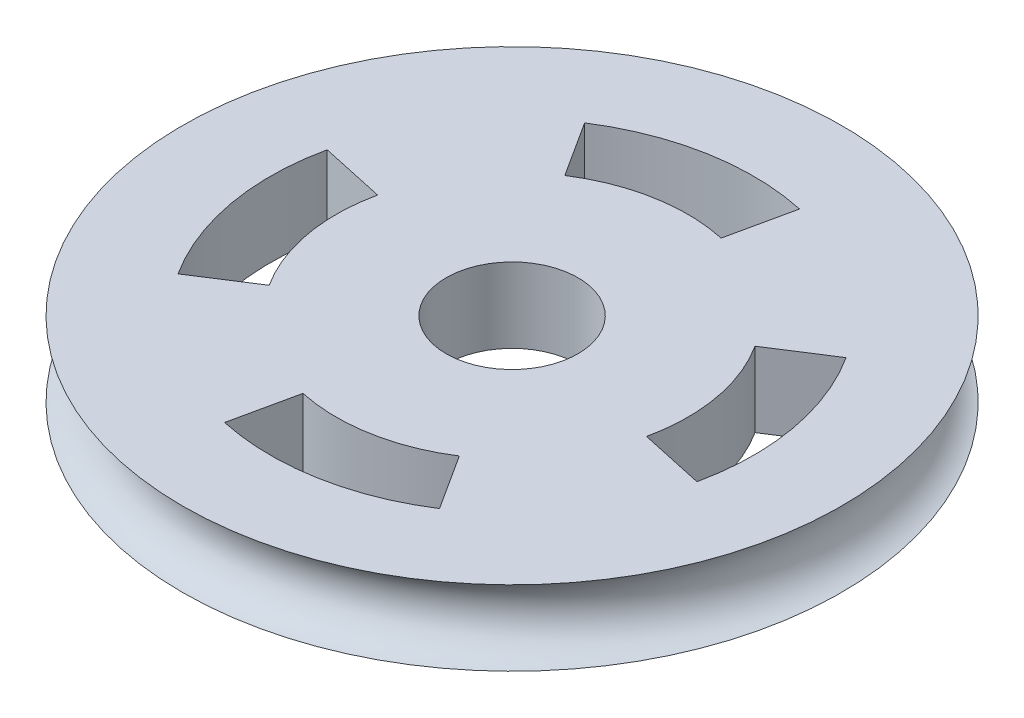
ISO-10303-21;
HEADER;
FILE_DESCRIPTION(('STEP AP214'),'2;1');
FILE_NAME('part.step','',(''),(''),'','','');
FILE_SCHEMA(('AUTOMOTIVE_DESIGN { 1 0 10303 214 1 1 1 1 }'));
ENDSEC;
DATA;
#1=APPLICATION_CONTEXT('core data for automotive mechanical design processes');
#2=APPLICATION_PROTOCOL_DEFINITION('international standard','automotive_design',2000,#1);
#3=PRODUCT_CONTEXT('',#1,'mechanical');
#4=PRODUCT('Part','Part','',(#3));
#5=PRODUCT_RELATED_PRODUCT_CATEGORY('part','',(#4));
#6=PRODUCT_DEFINITION_FORMATION('','',#4);
#7=PRODUCT_DEFINITION_CONTEXT('part definition',#1,'design');
#8=PRODUCT_DEFINITION('design','',#6,#7);
#9=PRODUCT_DEFINITION_SHAPE('','',#8);
#10=(LENGTH_UNIT() NAMED_UNIT(*) SI_UNIT(.MILLI.,.METRE.));
#11=(NAMED_UNIT(*) PLANE_ANGLE_UNIT() SI_UNIT($,.RADIAN.));
#12=(NAMED_UNIT(*) SI_UNIT($,.STERADIAN.) SOLID_ANGLE_UNIT());
#13=UNCERTAINTY_MEASURE_WITH_UNIT(LENGTH_MEASURE(1.E-05),#10,'distance_accuracy_value','');
#14=(GEOMETRIC_REPRESENTATION_CONTEXT(3) GLOBAL_UNCERTAINTY_ASSIGNED_CONTEXT((#13)) GLOBAL_UNIT_ASSIGNED_CONTEXT((#10,
#11,#12)) REPRESENTATION_CONTEXT('',''));
#15=CARTESIAN_POINT('',(0.,0.,0.));
#16=DIRECTION('',(0.,0.,1.));
#17=DIRECTION('',(1.,0.,0.));
#18=AXIS2_PLACEMENT_3D('',#15,#16,#17);
#19=CARTESIAN_POINT('',(0.2,-0.851836251870041,0.));
#20=DIRECTION('',(0.,-1.,0.));
#21=DIRECTION('',(0.,0.,-1.));
#22=AXIS2_PLACEMENT_3D('',#19,#20,#21);
#23=PLANE('',#22);
#24=CARTESIAN_POINT('',(7.7,-0.851836251870041,0.));
#25=DIRECTION('',(0.,1.,0.));
#26=DIRECTION('',(0.,0.,1.));
#27=AXIS2_PLACEMENT_3D('',#24,#25,#26);
#28=CIRCLE('',#27,1.5);
#29=CARTESIAN_POINT('',(7.7,-0.851836251870041,1.5));
#30=VERTEX_POINT('',#29);
#31=EDGE_CURVE('E45',#30,#30,#28,.T.);
#32=ORIENTED_EDGE('',*,*,#31,.T.);
#33=EDGE_LOOP('',(#32));
#34=FACE_BOUND('',#33,.T.);
#35=CARTESIAN_POINT('',(7.7,-0.851836251870041,0.));
#36=DIRECTION('',(0.,1.,0.));
#37=DIRECTION('',(0.,0.,1.));
#38=AXIS2_PLACEMENT_3D('',#35,#36,#37);
#39=CIRCLE('',#38,7.5);
#40=CARTESIAN_POINT('',(7.7,-0.851836251870041,7.5));
#41=VERTEX_POINT('',#40);
#42=EDGE_CURVE('E11',#41,#41,#39,.T.);
#43=ORIENTED_EDGE('',*,*,#42,.F.);
#44=EDGE_LOOP('',(#43));
#45=FACE_BOUND('',#44,.T.);
#46=DIRECTION('',(0.841060390721997,0.,-0.54094123447798));
#47=VECTOR('',#46,1.);
#48=CARTESIAN_POINT('',(2.25315412752092,-0.851836251870041,3.50322469441321));
#49=LINE('',#48,#47);
#50=CARTESIAN_POINT('',(3.07416785102901,-0.851836251870041,2.97517678962889));
#51=VERTEX_POINT('',#50);
#52=CARTESIAN_POINT('',(4.33575843711201,-0.851836251870041,2.16376493791192));
#53=VERTEX_POINT('',#52);
#54=EDGE_CURVE('E262',#51,#53,#49,.T.);
#55=ORIENTED_EDGE('',*,*,#54,.T.);
#56=CARTESIAN_POINT('',(7.7,-0.851836251870041,0.));
#57=DIRECTION('',(0.,-1.,0.));
#58=DIRECTION('',(0.,0.,-1.));
#59=AXIS2_PLACEMENT_3D('',#56,#57,#58);
#60=CIRCLE('',#59,4.);
#61=CARTESIAN_POINT('',(3.79110911684106,-0.851836251870041,-0.848865162176499));
#62=VERTEX_POINT('',#61);
#63=EDGE_CURVE('E188',#53,#62,#60,.T.);
#64=ORIENTED_EDGE('',*,*,#63,.T.);
#65=DIRECTION('',(-0.977222720789735,0.,-0.212216290544125));
#66=VECTOR('',#65,1.);
#67=CARTESIAN_POINT('',(0.346775305586774,-0.851836251870041,-1.59684587247904));
#68=LINE('',#67,#66);
#69=CARTESIAN_POINT('',(2.32527503565646,-0.851836251870041,-1.16718959799269));
#70=VERTEX_POINT('',#69);
#71=EDGE_CURVE('E252',#62,#70,#68,.T.);
#72=ORIENTED_EDGE('',*,*,#71,.T.);
#73=CARTESIAN_POINT('',(7.7,-0.851836251870041,0.));
#74=DIRECTION('',(0.,-1.,0.));
#75=DIRECTION('',(0.,0.,-1.));
#76=AXIS2_PLACEMENT_3D('',#73,#74,#75);
#77=CIRCLE('',#76,5.5);
#78=EDGE_CURVE('E265',#51,#70,#77,.T.);
#79=ORIENTED_EDGE('',*,*,#78,.F.);
#80=EDGE_LOOP('',(#55,#64,#72,#79));
#81=FACE_BOUND('',#80,.T.);
#82=DIRECTION('',(0.540941234477989,0.,0.841060390721992));
#83=VECTOR('',#82,1.);
#84=CARTESIAN_POINT('',(4.19677530558673,-0.851836251870041,-5.44684587247904));
#85=LINE('',#84,#83);
#86=CARTESIAN_POINT('',(4.72482321037106,-0.851836251870041,-4.62583214897096));
#87=VERTEX_POINT('',#86);
#88=CARTESIAN_POINT('',(5.53623506208805,-0.851836251870041,-3.36424156288797));
#89=VERTEX_POINT('',#88);
#90=EDGE_CURVE('E233',#87,#89,#85,.T.);
#91=ORIENTED_EDGE('',*,*,#90,.T.);
#92=CARTESIAN_POINT('',(7.7,-0.851836251870041,0.));
#93=DIRECTION('',(0.,-1.,0.));
#94=DIRECTION('',(1.,0.,0.));
#95=AXIS2_PLACEMENT_3D('',#92,#93,#94);
#96=CIRCLE('',#95,4.);
#97=CARTESIAN_POINT('',(8.54886516217646,-0.851836251870041,-3.90889088315895));
#98=VERTEX_POINT('',#97);
#99=EDGE_CURVE('E230',#89,#98,#96,.T.);
#100=ORIENTED_EDGE('',*,*,#99,.T.);
#101=DIRECTION('',(0.212216290544114,0.,-0.977222720789737));
#102=VECTOR('',#101,1.);
#103=CARTESIAN_POINT('',(9.29684587247897,-0.851836251870041,-7.35322469441324));
#104=LINE('',#103,#102);
#105=CARTESIAN_POINT('',(8.86718959799263,-0.851836251870041,-5.37472496434355));
#106=VERTEX_POINT('',#105);
#107=EDGE_CURVE('E222',#98,#106,#104,.T.);
#108=ORIENTED_EDGE('',*,*,#107,.T.);
#109=CARTESIAN_POINT('',(7.7,-0.851836251870041,0.));
#110=DIRECTION('',(0.,-1.,0.));
#111=DIRECTION('',(1.,0.,0.));
#112=AXIS2_PLACEMENT_3D('',#109,#110,#111);
#113=CIRCLE('',#112,5.5);
#114=EDGE_CURVE('E236',#87,#106,#113,.T.);
#115=ORIENTED_EDGE('',*,*,#114,.F.);
#116=EDGE_LOOP('',(#91,#100,#108,#115));
#117=FACE_BOUND('',#116,.T.);
#118=DIRECTION('',(-0.841060390721997,0.,0.54094123447798));
#119=VECTOR('',#118,1.);
#120=CARTESIAN_POINT('',(13.1468458724791,-0.851836251870041,-3.50322469441321));
#121=LINE('',#120,#119);
#122=CARTESIAN_POINT('',(12.325832148971,-0.851836251870041,-2.97517678962889));
#123=VERTEX_POINT('',#122);
#124=CARTESIAN_POINT('',(11.064241562888,-0.851836251870041,-2.16376493791192));
#125=VERTEX_POINT('',#124);
#126=EDGE_CURVE('E204',#123,#125,#121,.T.);
#127=ORIENTED_EDGE('',*,*,#126,.T.);
#128=CARTESIAN_POINT('',(7.7,-0.851836251870041,0.));
#129=DIRECTION('',(0.,-1.,0.));
#130=DIRECTION('',(0.,0.,1.));
#131=AXIS2_PLACEMENT_3D('',#128,#129,#130);
#132=CIRCLE('',#131,4.);
#133=CARTESIAN_POINT('',(11.6088908831589,-0.851836251870041,0.848865162176499));
#134=VERTEX_POINT('',#133);
#135=EDGE_CURVE('E60',#125,#134,#132,.T.);
#136=ORIENTED_EDGE('',*,*,#135,.T.);
#137=DIRECTION('',(0.977222720789735,0.,0.212216290544125));
#138=VECTOR('',#137,1.);
#139=CARTESIAN_POINT('',(15.0532246944132,-0.851836251870041,1.59684587247904));
#140=LINE('',#139,#138);
#141=CARTESIAN_POINT('',(13.0747249643435,-0.851836251870041,1.16718959799269));
#142=VERTEX_POINT('',#141);
#143=EDGE_CURVE('E195',#134,#142,#140,.T.);
#144=ORIENTED_EDGE('',*,*,#143,.T.);
#145=CARTESIAN_POINT('',(7.7,-0.851836251870041,0.));
#146=DIRECTION('',(0.,-1.,0.));
#147=DIRECTION('',(0.,0.,1.));
#148=AXIS2_PLACEMENT_3D('',#145,#146,#147);
#149=CIRCLE('',#148,5.5);
#150=EDGE_CURVE('E208',#123,#142,#149,.T.);
#151=ORIENTED_EDGE('',*,*,#150,.F.);
#152=EDGE_LOOP('',(#127,#136,#144,#151));
#153=FACE_BOUND('',#152,.T.);
#154=DIRECTION('',(-0.540941234477983,0.,-0.841060390721996));
#155=VECTOR('',#154,1.);
#156=CARTESIAN_POINT('',(11.2032246944132,-0.851836251870041,5.44684587247907));
#157=LINE('',#156,#155);
#158=CARTESIAN_POINT('',(10.6751767896289,-0.851836251870041,4.62583214897098));
#159=VERTEX_POINT('',#158);
#160=CARTESIAN_POINT('',(9.86376493791193,-0.851836251870041,3.36424156288798));
#161=VERTEX_POINT('',#160);
#162=EDGE_CURVE('E181',#159,#161,#157,.T.);
#163=ORIENTED_EDGE('',*,*,#162,.T.);
#164=CARTESIAN_POINT('',(7.7,-0.851836251870041,0.));
#165=DIRECTION('',(0.,-1.,0.));
#166=DIRECTION('',(-1.,0.,0.));
#167=AXIS2_PLACEMENT_3D('',#164,#165,#166);
#168=CIRCLE('',#167,4.);
#169=CARTESIAN_POINT('',(6.85113483782352,-0.851836251870041,3.90889088315894));
#170=VERTEX_POINT('',#169);
#171=EDGE_CURVE('E52',#161,#170,#168,.T.);
#172=ORIENTED_EDGE('',*,*,#171,.T.);
#173=DIRECTION('',(-0.212216290544121,0.,0.977222720789736));
#174=VECTOR('',#173,1.);
#175=CARTESIAN_POINT('',(6.10315412752098,-0.851836251870041,7.35322469441323));
#176=LINE('',#175,#174);
#177=CARTESIAN_POINT('',(6.53281040200733,-0.851836251870041,5.37472496434354));
#178=VERTEX_POINT('',#177);
#179=EDGE_CURVE('E172',#170,#178,#176,.T.);
#180=ORIENTED_EDGE('',*,*,#179,.T.);
#181=CARTESIAN_POINT('',(7.7,-0.851836251870041,0.));
#182=DIRECTION('',(0.,-1.,0.));
#183=DIRECTION('',(-1.,0.,0.));
#184=AXIS2_PLACEMENT_3D('',#181,#182,#183);
#185=CIRCLE('',#184,5.5);
#186=EDGE_CURVE('E175',#159,#178,#185,.T.);
#187=ORIENTED_EDGE('',*,*,#186,.F.);
#188=EDGE_LOOP('',(#163,#172,#180,#187));
#189=FACE_BOUND('',#188,.T.);
#190=ADVANCED_FACE('F37',(#34,#45,#81,#117,#153,#189),#23,.T.);
#191=CARTESIAN_POINT('',(0.2,0.851836251870041,0.));
#192=DIRECTION('',(0.,1.,0.));
#193=DIRECTION('',(0.,0.,1.));
#194=AXIS2_PLACEMENT_3D('',#191,#192,#193);
#195=PLANE('',#194);
#196=CARTESIAN_POINT('',(7.7,0.851836251870041,0.));
#197=DIRECTION('',(0.,1.,0.));
#198=DIRECTION('',(0.,0.,1.));
#199=AXIS2_PLACEMENT_3D('',#196,#197,#198);
#200=CIRCLE('',#199,7.5);
#201=CARTESIAN_POINT('',(7.7,0.851836251870041,7.5));
#202=VERTEX_POINT('',#201);
#203=EDGE_CURVE('E273',#202,#202,#200,.T.);
#204=ORIENTED_EDGE('',*,*,#203,.T.);
#205=EDGE_LOOP('',(#204));
#206=FACE_BOUND('',#205,.T.);
#207=CARTESIAN_POINT('',(7.7,0.851836251870041,0.));
#208=DIRECTION('',(0.,1.,0.));
#209=DIRECTION('',(0.,0.,1.));
#210=AXIS2_PLACEMENT_3D('',#207,#208,#209);
#211=CIRCLE('',#210,1.5);
#212=CARTESIAN_POINT('',(7.7,0.851836251870041,1.5));
#213=VERTEX_POINT('',#212);
#214=EDGE_CURVE('E282',#213,#213,#211,.T.);
#215=ORIENTED_EDGE('',*,*,#214,.F.);
#216=EDGE_LOOP('',(#215));
#217=FACE_BOUND('',#216,.T.);
#218=DIRECTION('',(-0.977222720789735,0.,-0.212216290544125));
#219=VECTOR('',#218,1.);
#220=CARTESIAN_POINT('',(0.346775305586774,0.851836251870041,-1.59684587247904));
#221=LINE('',#220,#219);
#222=CARTESIAN_POINT('',(3.79110911684106,0.851836251870041,-0.848865162176499));
#223=VERTEX_POINT('',#222);
#224=CARTESIAN_POINT('',(2.32527503565646,0.851836251870041,-1.16718959799269));
#225=VERTEX_POINT('',#224);
#226=EDGE_CURVE('E257',#223,#225,#221,.T.);
#227=ORIENTED_EDGE('',*,*,#226,.F.);
#228=CARTESIAN_POINT('',(7.7,0.851836251870041,0.));
#229=DIRECTION('',(0.,-1.,0.));
#230=DIRECTION('',(0.,0.,-1.));
#231=AXIS2_PLACEMENT_3D('',#228,#229,#230);
#232=CIRCLE('',#231,4.);
#233=CARTESIAN_POINT('',(4.33575843711201,0.851836251870041,2.16376493791192));
#234=VERTEX_POINT('',#233);
#235=EDGE_CURVE('E249',#234,#223,#232,.T.);
#236=ORIENTED_EDGE('',*,*,#235,.F.);
#237=DIRECTION('',(0.841060390721997,0.,-0.54094123447798));
#238=VECTOR('',#237,1.);
#239=CARTESIAN_POINT('',(2.25315412752092,0.851836251870041,3.50322469441321));
#240=LINE('',#239,#238);
#241=CARTESIAN_POINT('',(3.07416785102901,0.851836251870041,2.97517678962889));
#242=VERTEX_POINT('',#241);
#243=EDGE_CURVE('E251',#242,#234,#240,.T.);
#244=ORIENTED_EDGE('',*,*,#243,.F.);
#245=CARTESIAN_POINT('',(7.7,0.851836251870041,0.));
#246=DIRECTION('',(0.,-1.,0.));
#247=DIRECTION('',(0.,0.,-1.));
#248=AXIS2_PLACEMENT_3D('',#245,#246,#247);
#249=CIRCLE('',#248,5.5);
#250=EDGE_CURVE('E254',#242,#225,#249,.T.);
#251=ORIENTED_EDGE('',*,*,#250,.T.);
#252=EDGE_LOOP('',(#227,#236,#244,#251));
#253=FACE_BOUND('',#252,.T.);
#254=DIRECTION('',(0.212216290544114,0.,-0.977222720789737));
#255=VECTOR('',#254,1.);
#256=CARTESIAN_POINT('',(9.29684587247897,0.851836251870041,-7.35322469441324));
#257=LINE('',#256,#255);
#258=CARTESIAN_POINT('',(8.54886516217646,0.851836251870041,-3.90889088315895));
#259=VERTEX_POINT('',#258);
#260=CARTESIAN_POINT('',(8.86718959799263,0.851836251870041,-5.37472496434355));
#261=VERTEX_POINT('',#260);
#262=EDGE_CURVE('E227',#259,#261,#257,.T.);
#263=ORIENTED_EDGE('',*,*,#262,.F.);
#264=CARTESIAN_POINT('',(7.7,0.851836251870041,0.));
#265=DIRECTION('',(0.,-1.,0.));
#266=DIRECTION('',(1.,0.,0.));
#267=AXIS2_PLACEMENT_3D('',#264,#265,#266);
#268=CIRCLE('',#267,4.);
#269=CARTESIAN_POINT('',(5.53623506208805,0.851836251870041,-3.36424156288797));
#270=VERTEX_POINT('',#269);
#271=EDGE_CURVE('E219',#270,#259,#268,.T.);
#272=ORIENTED_EDGE('',*,*,#271,.F.);
#273=DIRECTION('',(0.540941234477989,0.,0.841060390721992));
#274=VECTOR('',#273,1.);
#275=CARTESIAN_POINT('',(4.19677530558673,0.851836251870041,-5.44684587247904));
#276=LINE('',#275,#274);
#277=CARTESIAN_POINT('',(4.72482321037106,0.851836251870041,-4.62583214897096));
#278=VERTEX_POINT('',#277);
#279=EDGE_CURVE('E221',#278,#270,#276,.T.);
#280=ORIENTED_EDGE('',*,*,#279,.F.);
#281=CARTESIAN_POINT('',(7.7,0.851836251870041,0.));
#282=DIRECTION('',(0.,-1.,0.));
#283=DIRECTION('',(1.,0.,0.));
#284=AXIS2_PLACEMENT_3D('',#281,#282,#283);
#285=CIRCLE('',#284,5.5);
#286=EDGE_CURVE('E224',#278,#261,#285,.T.);
#287=ORIENTED_EDGE('',*,*,#286,.T.);
#288=EDGE_LOOP('',(#263,#272,#280,#287));
#289=FACE_BOUND('',#288,.T.);
#290=DIRECTION('',(0.977222720789735,0.,0.212216290544125));
#291=VECTOR('',#290,1.);
#292=CARTESIAN_POINT('',(15.0532246944132,0.851836251870041,1.59684587247904));
#293=LINE('',#292,#291);
#294=CARTESIAN_POINT('',(11.6088908831589,0.851836251870041,0.848865162176499));
#295=VERTEX_POINT('',#294);
#296=CARTESIAN_POINT('',(13.0747249643435,0.851836251870041,1.16718959799269));
#297=VERTEX_POINT('',#296);
#298=EDGE_CURVE('E200',#295,#297,#293,.T.);
#299=ORIENTED_EDGE('',*,*,#298,.F.);
#300=CARTESIAN_POINT('',(7.7,0.851836251870041,0.));
#301=DIRECTION('',(0.,-1.,0.));
#302=DIRECTION('',(0.,0.,1.));
#303=AXIS2_PLACEMENT_3D('',#300,#301,#302);
#304=CIRCLE('',#303,4.);
#305=CARTESIAN_POINT('',(11.064241562888,0.851836251870041,-2.16376493791192));
#306=VERTEX_POINT('',#305);
#307=EDGE_CURVE('E192',#306,#295,#304,.T.);
#308=ORIENTED_EDGE('',*,*,#307,.F.);
#309=DIRECTION('',(-0.841060390721997,0.,0.54094123447798));
#310=VECTOR('',#309,1.);
#311=CARTESIAN_POINT('',(13.1468458724791,0.851836251870041,-3.50322469441321));
#312=LINE('',#311,#310);
#313=CARTESIAN_POINT('',(12.325832148971,0.851836251870041,-2.97517678962889));
#314=VERTEX_POINT('',#313);
#315=EDGE_CURVE('E194',#314,#306,#312,.T.);
#316=ORIENTED_EDGE('',*,*,#315,.F.);
#317=CARTESIAN_POINT('',(7.7,0.851836251870041,0.));
#318=DIRECTION('',(0.,-1.,0.));
#319=DIRECTION('',(0.,0.,1.));
#320=AXIS2_PLACEMENT_3D('',#317,#318,#319);
#321=CIRCLE('',#320,5.5);
#322=EDGE_CURVE('E197',#314,#297,#321,.T.);
#323=ORIENTED_EDGE('',*,*,#322,.T.);
#324=EDGE_LOOP('',(#299,#308,#316,#323));
#325=FACE_BOUND('',#324,.T.);
#326=DIRECTION('',(-0.212216290544121,0.,0.977222720789736));
#327=VECTOR('',#326,1.);
#328=CARTESIAN_POINT('',(6.10315412752098,0.851836251870041,7.35322469441323));
#329=LINE('',#328,#327);
#330=CARTESIAN_POINT('',(6.85113483782352,0.851836251870041,3.90889088315894));
#331=VERTEX_POINT('',#330);
#332=CARTESIAN_POINT('',(6.53281040200733,0.851836251870041,5.37472496434354));
#333=VERTEX_POINT('',#332);
#334=EDGE_CURVE('E168',#331,#333,#329,.T.);
#335=ORIENTED_EDGE('',*,*,#334,.F.);
#336=CARTESIAN_POINT('',(7.7,0.851836251870041,0.));
#337=DIRECTION('',(0.,-1.,0.));
#338=DIRECTION('',(-1.,0.,0.));
#339=AXIS2_PLACEMENT_3D('',#336,#337,#338);
#340=CIRCLE('',#339,4.);
#341=CARTESIAN_POINT('',(9.86376493791193,0.851836251870041,3.36424156288798));
#342=VERTEX_POINT('',#341);
#343=EDGE_CURVE('E164',#342,#331,#340,.T.);
#344=ORIENTED_EDGE('',*,*,#343,.F.);
#345=DIRECTION('',(-0.540941234477983,0.,-0.841060390721996));
#346=VECTOR('',#345,1.);
#347=CARTESIAN_POINT('',(11.2032246944132,0.851836251870041,5.44684587247907));
#348=LINE('',#347,#346);
#349=CARTESIAN_POINT('',(10.6751767896289,0.851836251870041,4.62583214897098));
#350=VERTEX_POINT('',#349);
#351=EDGE_CURVE('E154',#350,#342,#348,.T.);
#352=ORIENTED_EDGE('',*,*,#351,.F.);
#353=CARTESIAN_POINT('',(7.7,0.851836251870041,0.));
#354=DIRECTION('',(0.,-1.,0.));
#355=DIRECTION('',(-1.,0.,0.));
#356=AXIS2_PLACEMENT_3D('',#353,#354,#355);
#357=CIRCLE('',#356,5.5);
#358=EDGE_CURVE('E163',#350,#333,#357,.T.);
#359=ORIENTED_EDGE('',*,*,#358,.T.);
#360=EDGE_LOOP('',(#335,#344,#352,#359));
#361=FACE_BOUND('',#360,.T.);
#362=ADVANCED_FACE('F171',(#206,#217,#253,#289,#325,#361),#195,.T.);
#363=CARTESIAN_POINT('',(7.7,0.,0.));
#364=DIRECTION('',(0.,1.,0.));
#365=DIRECTION('',(0.,0.,1.));
#366=AXIS2_PLACEMENT_3D('',#363,#364,#365);
#367=TOROIDAL_SURFACE('',#366,7.7,0.875);
#368=ORIENTED_EDGE('',*,*,#42,.T.);
#369=EDGE_LOOP('',(#368));
#370=FACE_BOUND('',#369,.T.);
#371=ORIENTED_EDGE('',*,*,#203,.F.);
#372=EDGE_LOOP('',(#371));
#373=FACE_BOUND('',#372,.T.);
#374=ADVANCED_FACE('F39',(#370,#373),#367,.F.);
#375=CARTESIAN_POINT('',(7.7,1.61903573430155,0.));
#376=DIRECTION('',(0.,1.,0.));
#377=DIRECTION('',(0.,0.,1.));
#378=AXIS2_PLACEMENT_3D('',#375,#376,#377);
#379=CYLINDRICAL_SURFACE('',#378,1.5);
#380=ORIENTED_EDGE('',*,*,#214,.T.);
#381=EDGE_LOOP('',(#380));
#382=FACE_BOUND('',#381,.T.);
#383=ORIENTED_EDGE('',*,*,#31,.F.);
#384=EDGE_LOOP('',(#383));
#385=FACE_BOUND('',#384,.T.);
#386=ADVANCED_FACE('F289',(#382,#385),#379,.F.);
#387=CARTESIAN_POINT('',(7.7,0.851836251870041,0.));
#388=DIRECTION('',(0.,-1.,0.));
#389=DIRECTION('',(0.,0.,-1.));
#390=AXIS2_PLACEMENT_3D('',#387,#388,#389);
#391=CYLINDRICAL_SURFACE('',#390,4.);
#392=ORIENTED_EDGE('',*,*,#63,.F.);
#393=DIRECTION('',(0.,-1.,0.));
#394=VECTOR('',#393,1.);
#395=CARTESIAN_POINT('',(4.33575843711201,0.851836251870041,2.16376493791192));
#396=LINE('',#395,#394);
#397=EDGE_CURVE('E259',#234,#53,#396,.T.);
#398=ORIENTED_EDGE('',*,*,#397,.F.);
#399=ORIENTED_EDGE('',*,*,#235,.T.);
#400=DIRECTION('',(0.,-1.,0.));
#401=VECTOR('',#400,1.);
#402=CARTESIAN_POINT('',(3.79110911684106,0.851836251870041,-0.848865162176499));
#403=LINE('',#402,#401);
#404=EDGE_CURVE('E270',#223,#62,#403,.T.);
#405=ORIENTED_EDGE('',*,*,#404,.T.);
#406=EDGE_LOOP('',(#392,#398,#399,#405));
#407=FACE_BOUND('',#406,.T.);
#408=ADVANCED_FACE('F291',(#407),#391,.T.);
#409=CARTESIAN_POINT('',(0.346775305586774,0.851836251870041,-1.59684587247904));
#410=DIRECTION('',(-0.212216290544125,0.,0.977222720789735));
#411=DIRECTION('',(0.977222720789735,0.,0.212216290544125));
#412=AXIS2_PLACEMENT_3D('',#409,#410,#411);
#413=PLANE('',#412);
#414=ORIENTED_EDGE('',*,*,#71,.F.);
#415=ORIENTED_EDGE('',*,*,#404,.F.);
#416=ORIENTED_EDGE('',*,*,#226,.T.);
#417=DIRECTION('',(0.,-1.,0.));
#418=VECTOR('',#417,1.);
#419=CARTESIAN_POINT('',(2.32527503565646,0.851836251870041,-1.16718959799269));
#420=LINE('',#419,#418);
#421=EDGE_CURVE('E274',#225,#70,#420,.T.);
#422=ORIENTED_EDGE('',*,*,#421,.T.);
#423=EDGE_LOOP('',(#414,#415,#416,#422));
#424=FACE_BOUND('',#423,.T.);
#425=ADVANCED_FACE('F298',(#424),#413,.T.);
#426=CARTESIAN_POINT('',(7.7,0.851836251870041,0.));
#427=DIRECTION('',(0.,-1.,0.));
#428=DIRECTION('',(0.,0.,-1.));
#429=AXIS2_PLACEMENT_3D('',#426,#427,#428);
#430=CYLINDRICAL_SURFACE('',#429,5.5);
#431=ORIENTED_EDGE('',*,*,#78,.T.);
#432=ORIENTED_EDGE('',*,*,#421,.F.);
#433=ORIENTED_EDGE('',*,*,#250,.F.);
#434=DIRECTION('',(0.,-1.,0.));
#435=VECTOR('',#434,1.);
#436=CARTESIAN_POINT('',(3.07416785102901,0.851836251870041,2.97517678962889));
#437=LINE('',#436,#435);
#438=EDGE_CURVE('E276',#242,#51,#437,.T.);
#439=ORIENTED_EDGE('',*,*,#438,.T.);
#440=EDGE_LOOP('',(#431,#432,#433,#439));
#441=FACE_BOUND('',#440,.T.);
#442=ADVANCED_FACE('F316',(#441),#430,.F.);
#443=CARTESIAN_POINT('',(2.25315412752092,0.851836251870041,3.50322469441321));
#444=DIRECTION('',(-0.54094123447798,0.,-0.841060390721997));
#445=DIRECTION('',(-0.841060390721997,0.,0.54094123447798));
#446=AXIS2_PLACEMENT_3D('',#443,#444,#445);
#447=PLANE('',#446);
#448=ORIENTED_EDGE('',*,*,#54,.F.);
#449=ORIENTED_EDGE('',*,*,#438,.F.);
#450=ORIENTED_EDGE('',*,*,#243,.T.);
#451=ORIENTED_EDGE('',*,*,#397,.T.);
#452=EDGE_LOOP('',(#448,#449,#450,#451));
#453=FACE_BOUND('',#452,.T.);
#454=ADVANCED_FACE('F312',(#453),#447,.T.);
#455=CARTESIAN_POINT('',(7.7,0.851836251870041,0.));
#456=DIRECTION('',(0.,-1.,0.));
#457=DIRECTION('',(0.,0.,-1.));
#458=AXIS2_PLACEMENT_3D('',#455,#456,#457);
#459=CYLINDRICAL_SURFACE('',#458,4.);
#460=ORIENTED_EDGE('',*,*,#99,.F.);
#461=DIRECTION('',(0.,-1.,0.));
#462=VECTOR('',#461,1.);
#463=CARTESIAN_POINT('',(5.53623506208805,0.851836251870041,-3.36424156288797));
#464=LINE('',#463,#462);
#465=EDGE_CURVE('E229',#270,#89,#464,.T.);
#466=ORIENTED_EDGE('',*,*,#465,.F.);
#467=ORIENTED_EDGE('',*,*,#271,.T.);
#468=DIRECTION('',(0.,-1.,0.));
#469=VECTOR('',#468,1.);
#470=CARTESIAN_POINT('',(8.54886516217646,0.851836251870041,-3.90889088315895));
#471=LINE('',#470,#469);
#472=EDGE_CURVE('E205',#259,#98,#471,.T.);
#473=ORIENTED_EDGE('',*,*,#472,.T.);
#474=EDGE_LOOP('',(#460,#466,#467,#473));
#475=FACE_BOUND('',#474,.T.);
#476=ADVANCED_FACE('F315',(#475),#459,.T.);
#477=CARTESIAN_POINT('',(9.29684587247897,0.851836251870041,-7.35322469441324));
#478=DIRECTION('',(-0.977222720789737,0.,-0.212216290544114));
#479=DIRECTION('',(-0.212216290544114,0.,0.977222720789737));
#480=AXIS2_PLACEMENT_3D('',#477,#478,#479);
#481=PLANE('',#480);
#482=ORIENTED_EDGE('',*,*,#107,.F.);
#483=ORIENTED_EDGE('',*,*,#472,.F.);
#484=ORIENTED_EDGE('',*,*,#262,.T.);
#485=DIRECTION('',(0.,-1.,0.));
#486=VECTOR('',#485,1.);
#487=CARTESIAN_POINT('',(8.86718959799263,0.851836251870041,-5.37472496434355));
#488=LINE('',#487,#486);
#489=EDGE_CURVE('E243',#261,#106,#488,.T.);
#490=ORIENTED_EDGE('',*,*,#489,.T.);
#491=EDGE_LOOP('',(#482,#483,#484,#490));
#492=FACE_BOUND('',#491,.T.);
#493=ADVANCED_FACE('F326',(#492),#481,.T.);
#494=CARTESIAN_POINT('',(7.7,0.851836251870041,0.));
#495=DIRECTION('',(0.,-1.,0.));
#496=DIRECTION('',(0.,0.,-1.));
#497=AXIS2_PLACEMENT_3D('',#494,#495,#496);
#498=CYLINDRICAL_SURFACE('',#497,5.5);
#499=ORIENTED_EDGE('',*,*,#114,.T.);
#500=ORIENTED_EDGE('',*,*,#489,.F.);
#501=ORIENTED_EDGE('',*,*,#286,.F.);
#502=DIRECTION('',(0.,-1.,0.));
#503=VECTOR('',#502,1.);
#504=CARTESIAN_POINT('',(4.72482321037106,0.851836251870041,-4.62583214897096));
#505=LINE('',#504,#503);
#506=EDGE_CURVE('E245',#278,#87,#505,.T.);
#507=ORIENTED_EDGE('',*,*,#506,.T.);
#508=EDGE_LOOP('',(#499,#500,#501,#507));
#509=FACE_BOUND('',#508,.T.);
#510=ADVANCED_FACE('F332',(#509),#498,.F.);
#511=CARTESIAN_POINT('',(4.19677530558673,0.851836251870041,-5.44684587247904));
#512=DIRECTION('',(0.841060390721992,0.,-0.540941234477989));
#513=DIRECTION('',(-0.540941234477989,0.,-0.841060390721992));
#514=AXIS2_PLACEMENT_3D('',#511,#512,#513);
#515=PLANE('',#514);
#516=ORIENTED_EDGE('',*,*,#90,.F.);
#517=ORIENTED_EDGE('',*,*,#506,.F.);
#518=ORIENTED_EDGE('',*,*,#279,.T.);
#519=ORIENTED_EDGE('',*,*,#465,.T.);
#520=EDGE_LOOP('',(#516,#517,#518,#519));
#521=FACE_BOUND('',#520,.T.);
#522=ADVANCED_FACE('F328',(#521),#515,.T.);
#523=CARTESIAN_POINT('',(7.7,0.851836251870041,0.));
#524=DIRECTION('',(0.,-1.,0.));
#525=DIRECTION('',(0.,0.,-1.));
#526=AXIS2_PLACEMENT_3D('',#523,#524,#525);
#527=CYLINDRICAL_SURFACE('',#526,4.);
#528=ORIENTED_EDGE('',*,*,#135,.F.);
#529=DIRECTION('',(0.,-1.,0.));
#530=VECTOR('',#529,1.);
#531=CARTESIAN_POINT('',(11.064241562888,0.851836251870041,-2.16376493791192));
#532=LINE('',#531,#530);
#533=EDGE_CURVE('E202',#306,#125,#532,.T.);
#534=ORIENTED_EDGE('',*,*,#533,.F.);
#535=ORIENTED_EDGE('',*,*,#307,.T.);
#536=DIRECTION('',(0.,-1.,0.));
#537=VECTOR('',#536,1.);
#538=CARTESIAN_POINT('',(11.6088908831589,0.851836251870041,0.848865162176499));
#539=LINE('',#538,#537);
#540=EDGE_CURVE('E182',#295,#134,#539,.T.);
#541=ORIENTED_EDGE('',*,*,#540,.T.);
#542=EDGE_LOOP('',(#528,#534,#535,#541));
#543=FACE_BOUND('',#542,.T.);
#544=ADVANCED_FACE('F331',(#543),#527,.T.);
#545=CARTESIAN_POINT('',(15.0532246944132,0.851836251870041,1.59684587247904));
#546=DIRECTION('',(0.212216290544125,0.,-0.977222720789735));
#547=DIRECTION('',(-0.977222720789735,0.,-0.212216290544125));
#548=AXIS2_PLACEMENT_3D('',#545,#546,#547);
#549=PLANE('',#548);
#550=ORIENTED_EDGE('',*,*,#143,.F.);
#551=ORIENTED_EDGE('',*,*,#540,.F.);
#552=ORIENTED_EDGE('',*,*,#298,.T.);
#553=DIRECTION('',(0.,-1.,0.));
#554=VECTOR('',#553,1.);
#555=CARTESIAN_POINT('',(13.0747249643435,0.851836251870041,1.16718959799269));
#556=LINE('',#555,#554);
#557=EDGE_CURVE('E214',#297,#142,#556,.T.);
#558=ORIENTED_EDGE('',*,*,#557,.T.);
#559=EDGE_LOOP('',(#550,#551,#552,#558));
#560=FACE_BOUND('',#559,.T.);
#561=ADVANCED_FACE('F342',(#560),#549,.T.);
#562=CARTESIAN_POINT('',(7.7,0.851836251870041,0.));
#563=DIRECTION('',(0.,-1.,0.));
#564=DIRECTION('',(0.,0.,-1.));
#565=AXIS2_PLACEMENT_3D('',#562,#563,#564);
#566=CYLINDRICAL_SURFACE('',#565,5.5);
#567=ORIENTED_EDGE('',*,*,#150,.T.);
#568=ORIENTED_EDGE('',*,*,#557,.F.);
#569=ORIENTED_EDGE('',*,*,#322,.F.);
#570=DIRECTION('',(0.,-1.,0.));
#571=VECTOR('',#570,1.);
#572=CARTESIAN_POINT('',(12.325832148971,0.851836251870041,-2.97517678962889));
#573=LINE('',#572,#571);
#574=EDGE_CURVE('E216',#314,#123,#573,.T.);
#575=ORIENTED_EDGE('',*,*,#574,.T.);
#576=EDGE_LOOP('',(#567,#568,#569,#575));
#577=FACE_BOUND('',#576,.T.);
#578=ADVANCED_FACE('F346',(#577),#566,.F.);
#579=CARTESIAN_POINT('',(13.1468458724791,0.851836251870041,-3.50322469441321));
#580=DIRECTION('',(0.54094123447798,0.,0.841060390721997));
#581=DIRECTION('',(0.841060390721997,0.,-0.54094123447798));
#582=AXIS2_PLACEMENT_3D('',#579,#580,#581);
#583=PLANE('',#582);
#584=ORIENTED_EDGE('',*,*,#126,.F.);
#585=ORIENTED_EDGE('',*,*,#574,.F.);
#586=ORIENTED_EDGE('',*,*,#315,.T.);
#587=ORIENTED_EDGE('',*,*,#533,.T.);
#588=EDGE_LOOP('',(#584,#585,#586,#587));
#589=FACE_BOUND('',#588,.T.);
#590=ADVANCED_FACE('F343',(#589),#583,.T.);
#591=CARTESIAN_POINT('',(7.7,0.851836251870041,0.));
#592=DIRECTION('',(0.,-1.,0.));
#593=DIRECTION('',(0.,0.,-1.));
#594=AXIS2_PLACEMENT_3D('',#591,#592,#593);
#595=CYLINDRICAL_SURFACE('',#594,4.);
#596=ORIENTED_EDGE('',*,*,#171,.F.);
#597=DIRECTION('',(0.,-1.,0.));
#598=VECTOR('',#597,1.);
#599=CARTESIAN_POINT('',(9.86376493791193,0.851836251870041,3.36424156288798));
#600=LINE('',#599,#598);
#601=EDGE_CURVE('E157',#342,#161,#600,.T.);
#602=ORIENTED_EDGE('',*,*,#601,.F.);
#603=ORIENTED_EDGE('',*,*,#343,.T.);
#604=DIRECTION('',(0.,-1.,0.));
#605=VECTOR('',#604,1.);
#606=CARTESIAN_POINT('',(6.85113483782352,0.851836251870041,3.90889088315894));
#607=LINE('',#606,#605);
#608=EDGE_CURVE('E186',#331,#170,#607,.T.);
#609=ORIENTED_EDGE('',*,*,#608,.T.);
#610=EDGE_LOOP('',(#596,#602,#603,#609));
#611=FACE_BOUND('',#610,.T.);
#612=ADVANCED_FACE('F166',(#611),#595,.T.);
#613=CARTESIAN_POINT('',(6.10315412752098,0.851836251870041,7.35322469441323));
#614=DIRECTION('',(0.977222720789735,0.,0.212216290544121));
#615=DIRECTION('',(0.212216290544121,0.,-0.977222720789735));
#616=AXIS2_PLACEMENT_3D('',#613,#614,#615);
#617=PLANE('',#616);
#618=ORIENTED_EDGE('',*,*,#179,.F.);
#619=ORIENTED_EDGE('',*,*,#608,.F.);
#620=ORIENTED_EDGE('',*,*,#334,.T.);
#621=DIRECTION('',(0.,-1.,0.));
#622=VECTOR('',#621,1.);
#623=CARTESIAN_POINT('',(6.53281040200733,0.851836251870041,5.37472496434354));
#624=LINE('',#623,#622);
#625=EDGE_CURVE('E189',#333,#178,#624,.T.);
#626=ORIENTED_EDGE('',*,*,#625,.T.);
#627=EDGE_LOOP('',(#618,#619,#620,#626));
#628=FACE_BOUND('',#627,.T.);
#629=ADVANCED_FACE('F356',(#628),#617,.T.);
#630=CARTESIAN_POINT('',(7.7,0.851836251870041,0.));
#631=DIRECTION('',(0.,-1.,0.));
#632=DIRECTION('',(0.,0.,-1.));
#633=AXIS2_PLACEMENT_3D('',#630,#631,#632);
#634=CYLINDRICAL_SURFACE('',#633,5.5);
#635=ORIENTED_EDGE('',*,*,#186,.T.);
#636=ORIENTED_EDGE('',*,*,#625,.F.);
#637=ORIENTED_EDGE('',*,*,#358,.F.);
#638=DIRECTION('',(0.,-1.,0.));
#639=VECTOR('',#638,1.);
#640=CARTESIAN_POINT('',(10.6751767896289,0.851836251870041,4.62583214897098));
#641=LINE('',#640,#639);
#642=EDGE_CURVE('E159',#350,#159,#641,.T.);
#643=ORIENTED_EDGE('',*,*,#642,.T.);
#644=EDGE_LOOP('',(#635,#636,#637,#643));
#645=FACE_BOUND('',#644,.T.);
#646=ADVANCED_FACE('F359',(#645),#634,.F.);
#647=CARTESIAN_POINT('',(11.2032246944132,0.851836251870041,5.44684587247907));
#648=DIRECTION('',(-0.841060390721996,0.,0.540941234477983));
#649=DIRECTION('',(0.540941234477983,0.,0.841060390721996));
#650=AXIS2_PLACEMENT_3D('',#647,#648,#649);
#651=PLANE('',#650);
#652=ORIENTED_EDGE('',*,*,#162,.F.);
#653=ORIENTED_EDGE('',*,*,#642,.F.);
#654=ORIENTED_EDGE('',*,*,#351,.T.);
#655=ORIENTED_EDGE('',*,*,#601,.T.);
#656=EDGE_LOOP('',(#652,#653,#654,#655));
#657=FACE_BOUND('',#656,.T.);
#658=ADVANCED_FACE('F156',(#657),#651,.T.);
#659=CLOSED_SHELL('',(#190,#362,#374,#386,#408,#425,#442,#454,#476,#493,#510,#522,#544,#561,
#578,#590,#612,#629,#646,#658));
#660=MANIFOLD_SOLID_BREP('B2',#659);
#661=ADVANCED_BREP_SHAPE_REPRESENTATION('',(#18,#660),#14);
#662=SHAPE_DEFINITION_REPRESENTATION(#9,#661);
ENDSEC;
END-ISO-10303-21;
